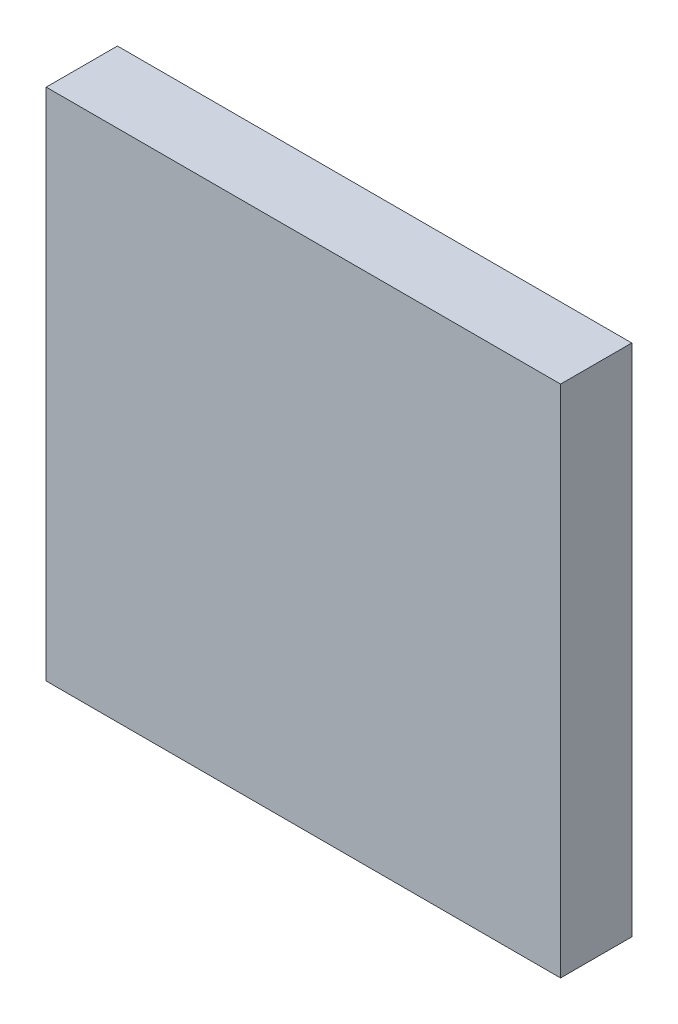
ISO-10303-21;
HEADER;
FILE_DESCRIPTION(('STEP AP214'),'2;1');
FILE_NAME('part.step','',(''),(''),'','','');
FILE_SCHEMA(('AUTOMOTIVE_DESIGN { 1 0 10303 214 1 1 1 1 }'));
ENDSEC;
DATA;
#1=APPLICATION_CONTEXT('core data for automotive mechanical design processes');
#2=APPLICATION_PROTOCOL_DEFINITION('international standard','automotive_design',2000,#1);
#3=PRODUCT_CONTEXT('',#1,'mechanical');
#4=PRODUCT('Part','Part','',(#3));
#5=PRODUCT_RELATED_PRODUCT_CATEGORY('part','',(#4));
#6=PRODUCT_DEFINITION_FORMATION('','',#4);
#7=PRODUCT_DEFINITION_CONTEXT('part definition',#1,'design');
#8=PRODUCT_DEFINITION('design','',#6,#7);
#9=PRODUCT_DEFINITION_SHAPE('','',#8);
#10=(LENGTH_UNIT() NAMED_UNIT(*) SI_UNIT(.MILLI.,.METRE.));
#11=(NAMED_UNIT(*) PLANE_ANGLE_UNIT() SI_UNIT($,.RADIAN.));
#12=(NAMED_UNIT(*) SI_UNIT($,.STERADIAN.) SOLID_ANGLE_UNIT());
#13=UNCERTAINTY_MEASURE_WITH_UNIT(LENGTH_MEASURE(1.E-05),#10,'distance_accuracy_value','');
#14=(GEOMETRIC_REPRESENTATION_CONTEXT(3) GLOBAL_UNCERTAINTY_ASSIGNED_CONTEXT((#13)) GLOBAL_UNIT_ASSIGNED_CONTEXT((#10,
#11,#12)) REPRESENTATION_CONTEXT('',''));
#15=CARTESIAN_POINT('',(0.,0.,0.));
#16=DIRECTION('',(0.,0.,1.));
#17=DIRECTION('',(1.,0.,0.));
#18=AXIS2_PLACEMENT_3D('',#15,#16,#17);
#19=CARTESIAN_POINT('',(32.5,-32.5,9.));
#20=DIRECTION('',(-1.,0.,0.));
#21=DIRECTION('',(0.,0.,1.));
#22=AXIS2_PLACEMENT_3D('',#19,#20,#21);
#23=PLANE('',#22);
#24=DIRECTION('',(0.,1.,0.));
#25=VECTOR('',#24,1.);
#26=CARTESIAN_POINT('',(32.5,-32.5,0.));
#27=LINE('',#26,#25);
#28=CARTESIAN_POINT('',(32.5,-32.5,0.));
#29=VERTEX_POINT('',#28);
#30=CARTESIAN_POINT('',(32.5,32.5,0.));
#31=VERTEX_POINT('',#30);
#32=EDGE_CURVE('E113',#29,#31,#27,.T.);
#33=ORIENTED_EDGE('',*,*,#32,.T.);
#34=DIRECTION('',(0.,0.,-1.));
#35=VECTOR('',#34,1.);
#36=CARTESIAN_POINT('',(32.5,32.5,9.));
#37=LINE('',#36,#35);
#38=CARTESIAN_POINT('',(32.5,32.5,9.));
#39=VERTEX_POINT('',#38);
#40=EDGE_CURVE('E11',#39,#31,#37,.T.);
#41=ORIENTED_EDGE('',*,*,#40,.F.);
#42=DIRECTION('',(0.,1.,0.));
#43=VECTOR('',#42,1.);
#44=CARTESIAN_POINT('',(32.5,-32.5,9.));
#45=LINE('',#44,#43);
#46=CARTESIAN_POINT('',(32.5,-32.5,9.));
#47=VERTEX_POINT('',#46);
#48=EDGE_CURVE('E97',#47,#39,#45,.T.);
#49=ORIENTED_EDGE('',*,*,#48,.F.);
#50=DIRECTION('',(0.,0.,-1.));
#51=VECTOR('',#50,1.);
#52=CARTESIAN_POINT('',(32.5,-32.5,9.));
#53=LINE('',#52,#51);
#54=EDGE_CURVE('E109',#47,#29,#53,.T.);
#55=ORIENTED_EDGE('',*,*,#54,.T.);
#56=EDGE_LOOP('',(#33,#41,#49,#55));
#57=FACE_BOUND('',#56,.T.);
#58=ADVANCED_FACE('F45',(#57),#23,.F.);
#59=CARTESIAN_POINT('',(-32.5,32.5,9.));
#60=DIRECTION('',(0.,-1.,0.));
#61=DIRECTION('',(0.,0.,-1.));
#62=AXIS2_PLACEMENT_3D('',#59,#60,#61);
#63=PLANE('',#62);
#64=DIRECTION('',(-1.,0.,0.));
#65=VECTOR('',#64,1.);
#66=CARTESIAN_POINT('',(-32.5,32.5,0.));
#67=LINE('',#66,#65);
#68=CARTESIAN_POINT('',(-32.5,32.5,0.));
#69=VERTEX_POINT('',#68);
#70=EDGE_CURVE('E102',#31,#69,#67,.T.);
#71=ORIENTED_EDGE('',*,*,#70,.T.);
#72=DIRECTION('',(0.,0.,-1.));
#73=VECTOR('',#72,1.);
#74=CARTESIAN_POINT('',(-32.5,32.5,9.));
#75=LINE('',#74,#73);
#76=CARTESIAN_POINT('',(-32.5,32.5,9.));
#77=VERTEX_POINT('',#76);
#78=EDGE_CURVE('E54',#77,#69,#75,.T.);
#79=ORIENTED_EDGE('',*,*,#78,.F.);
#80=DIRECTION('',(-1.,0.,0.));
#81=VECTOR('',#80,1.);
#82=CARTESIAN_POINT('',(-32.5,32.5,9.));
#83=LINE('',#82,#81);
#84=EDGE_CURVE('E92',#39,#77,#83,.T.);
#85=ORIENTED_EDGE('',*,*,#84,.F.);
#86=ORIENTED_EDGE('',*,*,#40,.T.);
#87=EDGE_LOOP('',(#71,#79,#85,#86));
#88=FACE_BOUND('',#87,.T.);
#89=ADVANCED_FACE('F101',(#88),#63,.F.);
#90=CARTESIAN_POINT('',(-32.5,-32.5,9.));
#91=DIRECTION('',(1.,0.,0.));
#92=DIRECTION('',(0.,0.,-1.));
#93=AXIS2_PLACEMENT_3D('',#90,#91,#92);
#94=PLANE('',#93);
#95=DIRECTION('',(0.,-1.,0.));
#96=VECTOR('',#95,1.);
#97=CARTESIAN_POINT('',(-32.5,-32.5,0.));
#98=LINE('',#97,#96);
#99=CARTESIAN_POINT('',(-32.5,-32.5,0.));
#100=VERTEX_POINT('',#99);
#101=EDGE_CURVE('E79',#69,#100,#98,.T.);
#102=ORIENTED_EDGE('',*,*,#101,.T.);
#103=DIRECTION('',(0.,0.,-1.));
#104=VECTOR('',#103,1.);
#105=CARTESIAN_POINT('',(-32.5,-32.5,9.));
#106=LINE('',#105,#104);
#107=CARTESIAN_POINT('',(-32.5,-32.5,9.));
#108=VERTEX_POINT('',#107);
#109=EDGE_CURVE('E104',#108,#100,#106,.T.);
#110=ORIENTED_EDGE('',*,*,#109,.F.);
#111=DIRECTION('',(0.,-1.,0.));
#112=VECTOR('',#111,1.);
#113=CARTESIAN_POINT('',(-32.5,-32.5,9.));
#114=LINE('',#113,#112);
#115=EDGE_CURVE('E95',#77,#108,#114,.T.);
#116=ORIENTED_EDGE('',*,*,#115,.F.);
#117=ORIENTED_EDGE('',*,*,#78,.T.);
#118=EDGE_LOOP('',(#102,#110,#116,#117));
#119=FACE_BOUND('',#118,.T.);
#120=ADVANCED_FACE('F105',(#119),#94,.F.);
#121=CARTESIAN_POINT('',(-32.5,-32.5,9.));
#122=DIRECTION('',(0.,1.,0.));
#123=DIRECTION('',(0.,0.,1.));
#124=AXIS2_PLACEMENT_3D('',#121,#122,#123);
#125=PLANE('',#124);
#126=DIRECTION('',(1.,0.,0.));
#127=VECTOR('',#126,1.);
#128=CARTESIAN_POINT('',(-32.5,-32.5,0.));
#129=LINE('',#128,#127);
#130=EDGE_CURVE('E85',#100,#29,#129,.T.);
#131=ORIENTED_EDGE('',*,*,#130,.T.);
#132=ORIENTED_EDGE('',*,*,#54,.F.);
#133=DIRECTION('',(1.,0.,0.));
#134=VECTOR('',#133,1.);
#135=CARTESIAN_POINT('',(-32.5,-32.5,9.));
#136=LINE('',#135,#134);
#137=EDGE_CURVE('E62',#108,#47,#136,.T.);
#138=ORIENTED_EDGE('',*,*,#137,.F.);
#139=ORIENTED_EDGE('',*,*,#109,.T.);
#140=EDGE_LOOP('',(#131,#132,#138,#139));
#141=FACE_BOUND('',#140,.T.);
#142=ADVANCED_FACE('F126',(#141),#125,.F.);
#143=CARTESIAN_POINT('',(0.,0.,9.));
#144=DIRECTION('',(0.,0.,-1.));
#145=DIRECTION('',(-1.,0.,0.));
#146=AXIS2_PLACEMENT_3D('',#143,#144,#145);
#147=PLANE('',#146);
#148=ORIENTED_EDGE('',*,*,#48,.T.);
#149=ORIENTED_EDGE('',*,*,#84,.T.);
#150=ORIENTED_EDGE('',*,*,#115,.T.);
#151=ORIENTED_EDGE('',*,*,#137,.T.);
#152=EDGE_LOOP('',(#148,#149,#150,#151));
#153=FACE_BOUND('',#152,.T.);
#154=ADVANCED_FACE('F93',(#153),#147,.F.);
#155=CARTESIAN_POINT('',(0.,0.,0.));
#156=DIRECTION('',(0.,0.,-1.));
#157=DIRECTION('',(-1.,0.,0.));
#158=AXIS2_PLACEMENT_3D('',#155,#156,#157);
#159=PLANE('',#158);
#160=ORIENTED_EDGE('',*,*,#32,.F.);
#161=ORIENTED_EDGE('',*,*,#130,.F.);
#162=ORIENTED_EDGE('',*,*,#101,.F.);
#163=ORIENTED_EDGE('',*,*,#70,.F.);
#164=EDGE_LOOP('',(#160,#161,#162,#163));
#165=FACE_BOUND('',#164,.T.);
#166=ADVANCED_FACE('F129',(#165),#159,.T.);
#167=CLOSED_SHELL('',(#58,#89,#120,#142,#154,#166));
#168=MANIFOLD_SOLID_BREP('B2',#167);
#169=ADVANCED_BREP_SHAPE_REPRESENTATION('',(#18,#168),#14);
#170=SHAPE_DEFINITION_REPRESENTATION(#9,#169);
ENDSEC;
END-ISO-10303-21;
